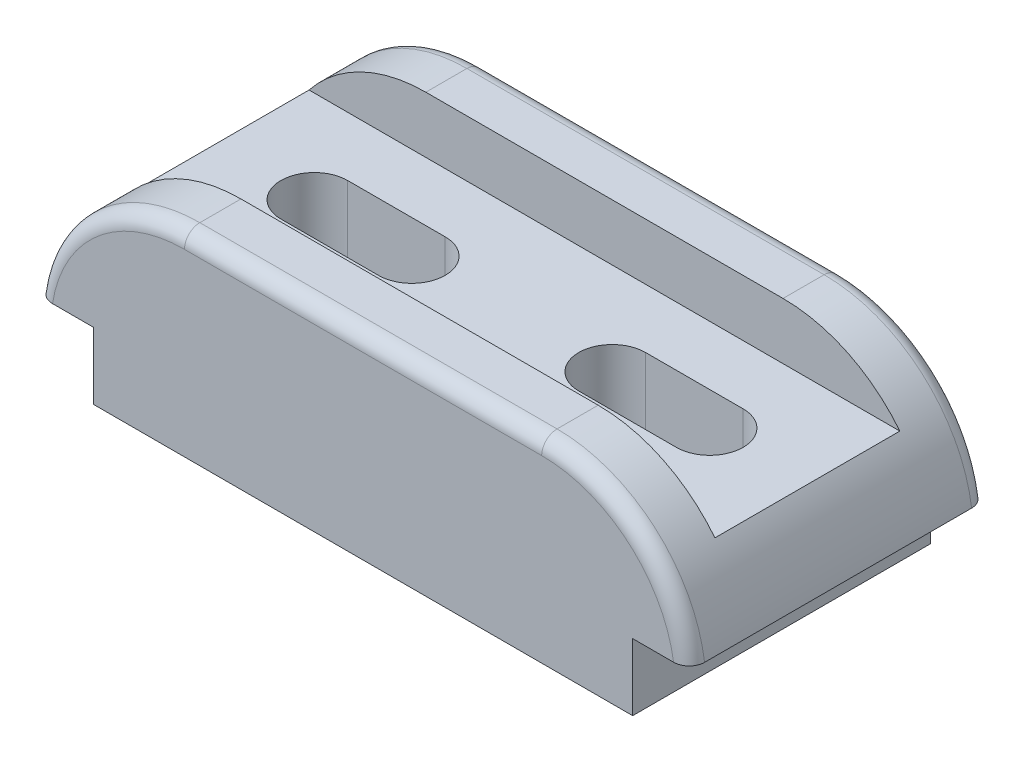
ISO-10303-21;
HEADER;
FILE_DESCRIPTION(('STEP AP214'),'2;1');
FILE_NAME('part.step','',(''),(''),'','','');
FILE_SCHEMA(('AUTOMOTIVE_DESIGN { 1 0 10303 214 1 1 1 1 }'));
ENDSEC;
DATA;
#1=APPLICATION_CONTEXT('core data for automotive mechanical design processes');
#2=APPLICATION_PROTOCOL_DEFINITION('international standard','automotive_design',2000,#1);
#3=PRODUCT_CONTEXT('',#1,'mechanical');
#4=PRODUCT('Part','Part','',(#3));
#5=PRODUCT_RELATED_PRODUCT_CATEGORY('part','',(#4));
#6=PRODUCT_DEFINITION_FORMATION('','',#4);
#7=PRODUCT_DEFINITION_CONTEXT('part definition',#1,'design');
#8=PRODUCT_DEFINITION('design','',#6,#7);
#9=PRODUCT_DEFINITION_SHAPE('','',#8);
#10=(LENGTH_UNIT() NAMED_UNIT(*) SI_UNIT(.MILLI.,.METRE.));
#11=(NAMED_UNIT(*) PLANE_ANGLE_UNIT() SI_UNIT($,.RADIAN.));
#12=(NAMED_UNIT(*) SI_UNIT($,.STERADIAN.) SOLID_ANGLE_UNIT());
#13=UNCERTAINTY_MEASURE_WITH_UNIT(LENGTH_MEASURE(1.E-05),#10,'distance_accuracy_value','');
#14=(GEOMETRIC_REPRESENTATION_CONTEXT(3) GLOBAL_UNCERTAINTY_ASSIGNED_CONTEXT((#13)) GLOBAL_UNIT_ASSIGNED_CONTEXT((#10,
#11,#12)) REPRESENTATION_CONTEXT('',''));
#15=CARTESIAN_POINT('',(0.,0.,0.));
#16=DIRECTION('',(0.,0.,1.));
#17=DIRECTION('',(1.,0.,0.));
#18=AXIS2_PLACEMENT_3D('',#15,#16,#17);
#19=CARTESIAN_POINT('',(-63.5,0.,29.));
#20=DIRECTION('',(0.,1.,0.));
#21=DIRECTION('',(0.,0.,1.));
#22=AXIS2_PLACEMENT_3D('',#19,#20,#21);
#23=PLANE('',#22);
#24=DIRECTION('',(1.,0.,0.));
#25=VECTOR('',#24,1.);
#26=CARTESIAN_POINT('',(-63.5,0.,-29.));
#27=LINE('',#26,#25);
#28=CARTESIAN_POINT('',(-52.5,0.,-29.));
#29=VERTEX_POINT('',#28);
#30=CARTESIAN_POINT('',(52.5,0.,-29.));
#31=VERTEX_POINT('',#30);
#32=EDGE_CURVE('E375',#29,#31,#27,.T.);
#33=ORIENTED_EDGE('',*,*,#32,.T.);
#34=DIRECTION('',(0.,0.,1.));
#35=VECTOR('',#34,1.);
#36=CARTESIAN_POINT('',(52.5,0.,-29.));
#37=LINE('',#36,#35);
#38=CARTESIAN_POINT('',(52.5,0.,29.));
#39=VERTEX_POINT('',#38);
#40=EDGE_CURVE('E338',#31,#39,#37,.T.);
#41=ORIENTED_EDGE('',*,*,#40,.T.);
#42=DIRECTION('',(1.,0.,0.));
#43=VECTOR('',#42,1.);
#44=CARTESIAN_POINT('',(-63.5,0.,29.));
#45=LINE('',#44,#43);
#46=CARTESIAN_POINT('',(-52.5,0.,29.));
#47=VERTEX_POINT('',#46);
#48=EDGE_CURVE('E381',#47,#39,#45,.T.);
#49=ORIENTED_EDGE('',*,*,#48,.F.);
#50=DIRECTION('',(0.,0.,1.));
#51=VECTOR('',#50,1.);
#52=CARTESIAN_POINT('',(-52.5,0.,-29.));
#53=LINE('',#52,#51);
#54=EDGE_CURVE('E364',#29,#47,#53,.T.);
#55=ORIENTED_EDGE('',*,*,#54,.F.);
#56=EDGE_LOOP('',(#33,#41,#49,#55));
#57=FACE_BOUND('',#56,.T.);
#58=DIRECTION('',(1.,0.,0.));
#59=VECTOR('',#58,1.);
#60=CARTESIAN_POINT('',(-19.5,0.,6.5));
#61=LINE('',#60,#59);
#62=CARTESIAN_POINT('',(-38.5,0.,6.5));
#63=VERTEX_POINT('',#62);
#64=CARTESIAN_POINT('',(-19.5,0.,6.5));
#65=VERTEX_POINT('',#64);
#66=EDGE_CURVE('E275',#63,#65,#61,.T.);
#67=ORIENTED_EDGE('',*,*,#66,.T.);
#68=CARTESIAN_POINT('',(-19.5,0.,0.));
#69=DIRECTION('',(0.,1.,0.));
#70=DIRECTION('',(0.,0.,-1.));
#71=AXIS2_PLACEMENT_3D('',#68,#69,#70);
#72=CIRCLE('',#71,6.5);
#73=CARTESIAN_POINT('',(-19.5,0.,-6.5));
#74=VERTEX_POINT('',#73);
#75=EDGE_CURVE('E262',#65,#74,#72,.T.);
#76=ORIENTED_EDGE('',*,*,#75,.T.);
#77=DIRECTION('',(-1.,0.,0.));
#78=VECTOR('',#77,1.);
#79=CARTESIAN_POINT('',(-19.5,0.,-6.5));
#80=LINE('',#79,#78);
#81=CARTESIAN_POINT('',(-38.5,0.,-6.5));
#82=VERTEX_POINT('',#81);
#83=EDGE_CURVE('E266',#74,#82,#80,.T.);
#84=ORIENTED_EDGE('',*,*,#83,.T.);
#85=CARTESIAN_POINT('',(-38.5,0.,0.));
#86=DIRECTION('',(0.,1.,0.));
#87=DIRECTION('',(0.,0.,-1.));
#88=AXIS2_PLACEMENT_3D('',#85,#86,#87);
#89=CIRCLE('',#88,6.5);
#90=EDGE_CURVE('E271',#82,#63,#89,.T.);
#91=ORIENTED_EDGE('',*,*,#90,.T.);
#92=EDGE_LOOP('',(#67,#76,#84,#91));
#93=FACE_BOUND('',#92,.T.);
#94=CARTESIAN_POINT('',(19.5,0.,0.));
#95=DIRECTION('',(0.,-1.,0.));
#96=DIRECTION('',(0.,0.,-1.));
#97=AXIS2_PLACEMENT_3D('',#94,#95,#96);
#98=CIRCLE('',#97,6.5);
#99=CARTESIAN_POINT('',(19.5,0.,6.5));
#100=VERTEX_POINT('',#99);
#101=CARTESIAN_POINT('',(19.5,0.,-6.5));
#102=VERTEX_POINT('',#101);
#103=EDGE_CURVE('E219',#100,#102,#98,.T.);
#104=ORIENTED_EDGE('',*,*,#103,.F.);
#105=DIRECTION('',(-1.,0.,0.));
#106=VECTOR('',#105,1.);
#107=CARTESIAN_POINT('',(19.5,0.,6.5));
#108=LINE('',#107,#106);
#109=CARTESIAN_POINT('',(38.5,0.,6.5));
#110=VERTEX_POINT('',#109);
#111=EDGE_CURVE('E206',#110,#100,#108,.T.);
#112=ORIENTED_EDGE('',*,*,#111,.F.);
#113=CARTESIAN_POINT('',(38.5,0.,0.));
#114=DIRECTION('',(0.,-1.,0.));
#115=DIRECTION('',(0.,0.,-1.));
#116=AXIS2_PLACEMENT_3D('',#113,#114,#115);
#117=CIRCLE('',#116,6.5);
#118=CARTESIAN_POINT('',(38.5,0.,-6.5));
#119=VERTEX_POINT('',#118);
#120=EDGE_CURVE('E218',#119,#110,#117,.T.);
#121=ORIENTED_EDGE('',*,*,#120,.F.);
#122=DIRECTION('',(1.,0.,0.));
#123=VECTOR('',#122,1.);
#124=CARTESIAN_POINT('',(19.5,0.,-6.5));
#125=LINE('',#124,#123);
#126=EDGE_CURVE('E228',#102,#119,#125,.T.);
#127=ORIENTED_EDGE('',*,*,#126,.F.);
#128=EDGE_LOOP('',(#104,#112,#121,#127));
#129=FACE_BOUND('',#128,.T.);
#130=ADVANCED_FACE('F40',(#57,#93,#129),#23,.F.);
#131=CARTESIAN_POINT('',(63.5,27.,-18.));
#132=DIRECTION('',(0.,-1.,0.));
#133=DIRECTION('',(0.,0.,-1.));
#134=AXIS2_PLACEMENT_3D('',#131,#132,#133);
#135=PLANE('',#134);
#136=DIRECTION('',(0.,0.,1.));
#137=VECTOR('',#136,1.);
#138=CARTESIAN_POINT('',(-57.514820769114,27.,29.));
#139=LINE('',#138,#137);
#140=CARTESIAN_POINT('',(-57.514820769114,27.,-18.));
#141=VERTEX_POINT('',#140);
#142=CARTESIAN_POINT('',(-57.514820769114,27.,18.));
#143=VERTEX_POINT('',#142);
#144=EDGE_CURVE('E314',#141,#143,#139,.T.);
#145=ORIENTED_EDGE('',*,*,#144,.T.);
#146=DIRECTION('',(1.,0.,0.));
#147=VECTOR('',#146,1.);
#148=CARTESIAN_POINT('',(63.5,27.,18.));
#149=LINE('',#148,#147);
#150=CARTESIAN_POINT('',(57.514820769114,27.,18.));
#151=VERTEX_POINT('',#150);
#152=EDGE_CURVE('E310',#143,#151,#149,.T.);
#153=ORIENTED_EDGE('',*,*,#152,.T.);
#154=DIRECTION('',(0.,0.,-1.));
#155=VECTOR('',#154,1.);
#156=CARTESIAN_POINT('',(57.514820769114,27.,29.));
#157=LINE('',#156,#155);
#158=CARTESIAN_POINT('',(57.514820769114,27.,-18.));
#159=VERTEX_POINT('',#158);
#160=EDGE_CURVE('E396',#151,#159,#157,.T.);
#161=ORIENTED_EDGE('',*,*,#160,.T.);
#162=DIRECTION('',(-1.,0.,0.));
#163=VECTOR('',#162,1.);
#164=CARTESIAN_POINT('',(63.5,27.,-18.));
#165=LINE('',#164,#163);
#166=EDGE_CURVE('E306',#159,#141,#165,.T.);
#167=ORIENTED_EDGE('',*,*,#166,.T.);
#168=EDGE_LOOP('',(#145,#153,#161,#167));
#169=FACE_BOUND('',#168,.T.);
#170=DIRECTION('',(-1.,0.,0.));
#171=VECTOR('',#170,1.);
#172=CARTESIAN_POINT('',(-19.5,27.,-6.5));
#173=LINE('',#172,#171);
#174=CARTESIAN_POINT('',(-19.5,27.,-6.5));
#175=VERTEX_POINT('',#174);
#176=CARTESIAN_POINT('',(-38.5,27.,-6.5));
#177=VERTEX_POINT('',#176);
#178=EDGE_CURVE('E282',#175,#177,#173,.T.);
#179=ORIENTED_EDGE('',*,*,#178,.F.);
#180=CARTESIAN_POINT('',(-19.5,27.,0.));
#181=DIRECTION('',(0.,1.,0.));
#182=DIRECTION('',(0.,0.,-1.));
#183=AXIS2_PLACEMENT_3D('',#180,#181,#182);
#184=CIRCLE('',#183,6.5);
#185=CARTESIAN_POINT('',(-19.5,27.,6.5));
#186=VERTEX_POINT('',#185);
#187=EDGE_CURVE('E256',#186,#175,#184,.T.);
#188=ORIENTED_EDGE('',*,*,#187,.F.);
#189=DIRECTION('',(1.,0.,0.));
#190=VECTOR('',#189,1.);
#191=CARTESIAN_POINT('',(-19.5,27.,6.5));
#192=LINE('',#191,#190);
#193=CARTESIAN_POINT('',(-38.5,27.,6.5));
#194=VERTEX_POINT('',#193);
#195=EDGE_CURVE('E267',#194,#186,#192,.T.);
#196=ORIENTED_EDGE('',*,*,#195,.F.);
#197=CARTESIAN_POINT('',(-38.5,27.,0.));
#198=DIRECTION('',(0.,1.,0.));
#199=DIRECTION('',(0.,0.,-1.));
#200=AXIS2_PLACEMENT_3D('',#197,#198,#199);
#201=CIRCLE('',#200,6.5);
#202=EDGE_CURVE('E286',#177,#194,#201,.T.);
#203=ORIENTED_EDGE('',*,*,#202,.F.);
#204=EDGE_LOOP('',(#179,#188,#196,#203));
#205=FACE_BOUND('',#204,.T.);
#206=CARTESIAN_POINT('',(19.5,27.,0.));
#207=DIRECTION('',(0.,-1.,0.));
#208=DIRECTION('',(0.,0.,-1.));
#209=AXIS2_PLACEMENT_3D('',#206,#207,#208);
#210=CIRCLE('',#209,6.5);
#211=CARTESIAN_POINT('',(19.5,27.,6.5));
#212=VERTEX_POINT('',#211);
#213=CARTESIAN_POINT('',(19.5,27.,-6.5));
#214=VERTEX_POINT('',#213);
#215=EDGE_CURVE('E226',#212,#214,#210,.T.);
#216=ORIENTED_EDGE('',*,*,#215,.T.);
#217=DIRECTION('',(1.,0.,0.));
#218=VECTOR('',#217,1.);
#219=CARTESIAN_POINT('',(19.5,27.,-6.5));
#220=LINE('',#219,#218);
#221=CARTESIAN_POINT('',(38.5,27.,-6.5));
#222=VERTEX_POINT('',#221);
#223=EDGE_CURVE('E232',#214,#222,#220,.T.);
#224=ORIENTED_EDGE('',*,*,#223,.T.);
#225=CARTESIAN_POINT('',(38.5,27.,0.));
#226=DIRECTION('',(0.,-1.,0.));
#227=DIRECTION('',(0.,0.,-1.));
#228=AXIS2_PLACEMENT_3D('',#225,#226,#227);
#229=CIRCLE('',#228,6.5);
#230=CARTESIAN_POINT('',(38.5,27.,6.5));
#231=VERTEX_POINT('',#230);
#232=EDGE_CURVE('E237',#222,#231,#229,.T.);
#233=ORIENTED_EDGE('',*,*,#232,.T.);
#234=DIRECTION('',(-1.,0.,0.));
#235=VECTOR('',#234,1.);
#236=CARTESIAN_POINT('',(19.5,27.,6.5));
#237=LINE('',#236,#235);
#238=EDGE_CURVE('E246',#231,#212,#237,.T.);
#239=ORIENTED_EDGE('',*,*,#238,.T.);
#240=EDGE_LOOP('',(#216,#224,#233,#239));
#241=FACE_BOUND('',#240,.T.);
#242=ADVANCED_FACE('F497',(#169,#205,#241),#135,.F.);
#243=CARTESIAN_POINT('',(-63.5,38.,29.));
#244=DIRECTION('',(0.,-1.,0.));
#245=DIRECTION('',(0.,0.,-1.));
#246=AXIS2_PLACEMENT_3D('',#243,#244,#245);
#247=PLANE('',#246);
#248=DIRECTION('',(0.,0.,1.));
#249=VECTOR('',#248,1.);
#250=CARTESIAN_POINT('',(-34.7771867673099,38.,29.));
#251=LINE('',#250,#249);
#252=CARTESIAN_POINT('',(-34.7771867673099,38.,18.));
#253=VERTEX_POINT('',#252);
#254=CARTESIAN_POINT('',(-34.7771867673099,38.,26.));
#255=VERTEX_POINT('',#254);
#256=EDGE_CURVE('E392',#253,#255,#251,.T.);
#257=ORIENTED_EDGE('',*,*,#256,.T.);
#258=DIRECTION('',(-1.,0.,0.));
#259=VECTOR('',#258,1.);
#260=CARTESIAN_POINT('',(-63.5,38.,26.));
#261=LINE('',#260,#259);
#262=CARTESIAN_POINT('',(34.7771867673099,38.,26.));
#263=VERTEX_POINT('',#262);
#264=EDGE_CURVE('E11',#255,#263,#261,.F.);
#265=ORIENTED_EDGE('',*,*,#264,.T.);
#266=DIRECTION('',(0.,0.,-1.));
#267=VECTOR('',#266,1.);
#268=CARTESIAN_POINT('',(34.7771867673099,38.,29.));
#269=LINE('',#268,#267);
#270=CARTESIAN_POINT('',(34.7771867673099,38.,18.));
#271=VERTEX_POINT('',#270);
#272=EDGE_CURVE('E389',#263,#271,#269,.T.);
#273=ORIENTED_EDGE('',*,*,#272,.T.);
#274=DIRECTION('',(1.,0.,0.));
#275=VECTOR('',#274,1.);
#276=CARTESIAN_POINT('',(63.5,38.,18.));
#277=LINE('',#276,#275);
#278=EDGE_CURVE('E311',#253,#271,#277,.T.);
#279=ORIENTED_EDGE('',*,*,#278,.F.);
#280=EDGE_LOOP('',(#257,#265,#273,#279));
#281=FACE_BOUND('',#280,.T.);
#282=ADVANCED_FACE('F503',(#281),#247,.F.);
#283=CARTESIAN_POINT('',(34.7771867673099,38.,-18.));
#284=VERTEX_POINT('',#283);
#285=CARTESIAN_POINT('',(34.7771867673099,38.,-26.));
#286=VERTEX_POINT('',#285);
#287=EDGE_CURVE('E385',#284,#286,#269,.T.);
#288=ORIENTED_EDGE('',*,*,#287,.T.);
#289=DIRECTION('',(-1.,0.,0.));
#290=VECTOR('',#289,1.);
#291=CARTESIAN_POINT('',(-34.7771867673099,38.,-26.));
#292=LINE('',#291,#290);
#293=CARTESIAN_POINT('',(-34.7771867673099,38.,-26.));
#294=VERTEX_POINT('',#293);
#295=EDGE_CURVE('E51',#286,#294,#292,.T.);
#296=ORIENTED_EDGE('',*,*,#295,.T.);
#297=CARTESIAN_POINT('',(-34.7771867673099,38.,-18.));
#298=VERTEX_POINT('',#297);
#299=EDGE_CURVE('E393',#294,#298,#251,.T.);
#300=ORIENTED_EDGE('',*,*,#299,.T.);
#301=DIRECTION('',(-1.,0.,0.));
#302=VECTOR('',#301,1.);
#303=CARTESIAN_POINT('',(63.5,38.,-18.));
#304=LINE('',#303,#302);
#305=EDGE_CURVE('E296',#284,#298,#304,.T.);
#306=ORIENTED_EDGE('',*,*,#305,.F.);
#307=EDGE_LOOP('',(#288,#296,#300,#306));
#308=FACE_BOUND('',#307,.T.);
#309=ADVANCED_FACE('F499',(#308),#247,.F.);
#310=CARTESIAN_POINT('',(-63.5,38.,29.));
#311=DIRECTION('',(0.,0.,-1.));
#312=DIRECTION('',(-1.,0.,0.));
#313=AXIS2_PLACEMENT_3D('',#310,#311,#312);
#314=PLANE('',#313);
#315=DIRECTION('',(-1.,0.,0.));
#316=VECTOR('',#315,1.);
#317=CARTESIAN_POINT('',(52.5,13.,29.));
#318=LINE('',#317,#316);
#319=CARTESIAN_POINT('',(60.4676519246401,13.,29.));
#320=VERTEX_POINT('',#319);
#321=CARTESIAN_POINT('',(52.5,13.,29.));
#322=VERTEX_POINT('',#321);
#323=EDGE_CURVE('E335',#320,#322,#318,.T.);
#324=ORIENTED_EDGE('',*,*,#323,.F.);
#325=CARTESIAN_POINT('',(34.7771867673099,9.,29.));
#326=DIRECTION('',(0.,0.,-1.));
#327=DIRECTION('',(-1.,0.,0.));
#328=AXIS2_PLACEMENT_3D('',#325,#326,#327);
#329=CIRCLE('',#328,26.);
#330=CARTESIAN_POINT('',(34.7771867673099,35.,29.));
#331=VERTEX_POINT('',#330);
#332=EDGE_CURVE('E512',#320,#331,#329,.F.);
#333=ORIENTED_EDGE('',*,*,#332,.T.);
#334=DIRECTION('',(-1.,0.,0.));
#335=VECTOR('',#334,1.);
#336=CARTESIAN_POINT('',(-63.5,35.,29.));
#337=LINE('',#336,#335);
#338=CARTESIAN_POINT('',(-34.7771867673099,35.,29.));
#339=VERTEX_POINT('',#338);
#340=EDGE_CURVE('E59',#331,#339,#337,.T.);
#341=ORIENTED_EDGE('',*,*,#340,.T.);
#342=CARTESIAN_POINT('',(-34.7771867673099,9.,29.));
#343=DIRECTION('',(0.,0.,-1.));
#344=DIRECTION('',(-1.,0.,0.));
#345=AXIS2_PLACEMENT_3D('',#342,#343,#344);
#346=CIRCLE('',#345,26.);
#347=CARTESIAN_POINT('',(-60.4676519246401,13.,29.));
#348=VERTEX_POINT('',#347);
#349=EDGE_CURVE('E516',#339,#348,#346,.F.);
#350=ORIENTED_EDGE('',*,*,#349,.T.);
#351=DIRECTION('',(-1.,0.,0.));
#352=VECTOR('',#351,1.);
#353=CARTESIAN_POINT('',(-63.5,13.,29.));
#354=LINE('',#353,#352);
#355=CARTESIAN_POINT('',(-52.5,13.,29.));
#356=VERTEX_POINT('',#355);
#357=EDGE_CURVE('E360',#356,#348,#354,.T.);
#358=ORIENTED_EDGE('',*,*,#357,.F.);
#359=DIRECTION('',(0.,1.,0.));
#360=VECTOR('',#359,1.);
#361=CARTESIAN_POINT('',(-52.5,13.,29.));
#362=LINE('',#361,#360);
#363=EDGE_CURVE('E347',#47,#356,#362,.T.);
#364=ORIENTED_EDGE('',*,*,#363,.F.);
#365=ORIENTED_EDGE('',*,*,#48,.T.);
#366=DIRECTION('',(0.,-1.,0.));
#367=VECTOR('',#366,1.);
#368=CARTESIAN_POINT('',(52.5,0.,29.));
#369=LINE('',#368,#367);
#370=EDGE_CURVE('E329',#322,#39,#369,.T.);
#371=ORIENTED_EDGE('',*,*,#370,.F.);
#372=EDGE_LOOP('',(#324,#333,#341,#350,#358,#364,#365,#371));
#373=FACE_BOUND('',#372,.T.);
#374=ADVANCED_FACE('F502',(#373),#314,.F.);
#375=CARTESIAN_POINT('',(-63.5,38.,-29.));
#376=DIRECTION('',(0.,0.,-1.));
#377=DIRECTION('',(-1.,0.,0.));
#378=AXIS2_PLACEMENT_3D('',#375,#376,#377);
#379=PLANE('',#378);
#380=DIRECTION('',(-1.,0.,0.));
#381=VECTOR('',#380,1.);
#382=CARTESIAN_POINT('',(34.7771867673099,35.,-29.));
#383=LINE('',#382,#381);
#384=CARTESIAN_POINT('',(-34.7771867673099,35.,-29.));
#385=VERTEX_POINT('',#384);
#386=CARTESIAN_POINT('',(34.7771867673099,35.,-29.));
#387=VERTEX_POINT('',#386);
#388=EDGE_CURVE('E406',#385,#387,#383,.F.);
#389=ORIENTED_EDGE('',*,*,#388,.T.);
#390=CARTESIAN_POINT('',(34.7771867673099,9.,-29.));
#391=DIRECTION('',(0.,0.,-1.));
#392=DIRECTION('',(-1.,0.,0.));
#393=AXIS2_PLACEMENT_3D('',#390,#391,#392);
#394=CIRCLE('',#393,26.);
#395=CARTESIAN_POINT('',(60.4676519246401,13.,-29.));
#396=VERTEX_POINT('',#395);
#397=EDGE_CURVE('E412',#387,#396,#394,.T.);
#398=ORIENTED_EDGE('',*,*,#397,.T.);
#399=DIRECTION('',(-1.,0.,0.));
#400=VECTOR('',#399,1.);
#401=CARTESIAN_POINT('',(52.5,13.,-29.));
#402=LINE('',#401,#400);
#403=CARTESIAN_POINT('',(52.5,13.,-29.));
#404=VERTEX_POINT('',#403);
#405=EDGE_CURVE('E334',#396,#404,#402,.T.);
#406=ORIENTED_EDGE('',*,*,#405,.T.);
#407=DIRECTION('',(0.,-1.,0.));
#408=VECTOR('',#407,1.);
#409=CARTESIAN_POINT('',(52.5,0.,-29.));
#410=LINE('',#409,#408);
#411=EDGE_CURVE('E330',#404,#31,#410,.T.);
#412=ORIENTED_EDGE('',*,*,#411,.T.);
#413=ORIENTED_EDGE('',*,*,#32,.F.);
#414=DIRECTION('',(0.,1.,0.));
#415=VECTOR('',#414,1.);
#416=CARTESIAN_POINT('',(-52.5,13.,-29.));
#417=LINE('',#416,#415);
#418=CARTESIAN_POINT('',(-52.5,13.,-29.));
#419=VERTEX_POINT('',#418);
#420=EDGE_CURVE('E355',#29,#419,#417,.T.);
#421=ORIENTED_EDGE('',*,*,#420,.T.);
#422=DIRECTION('',(-1.,0.,0.));
#423=VECTOR('',#422,1.);
#424=CARTESIAN_POINT('',(-63.5,13.,-29.));
#425=LINE('',#424,#423);
#426=CARTESIAN_POINT('',(-60.4676519246401,13.,-29.));
#427=VERTEX_POINT('',#426);
#428=EDGE_CURVE('E359',#419,#427,#425,.T.);
#429=ORIENTED_EDGE('',*,*,#428,.T.);
#430=CARTESIAN_POINT('',(-34.7771867673099,9.,-29.));
#431=DIRECTION('',(0.,0.,-1.));
#432=DIRECTION('',(-1.,0.,0.));
#433=AXIS2_PLACEMENT_3D('',#430,#431,#432);
#434=CIRCLE('',#433,26.);
#435=EDGE_CURVE('E409',#427,#385,#434,.T.);
#436=ORIENTED_EDGE('',*,*,#435,.T.);
#437=EDGE_LOOP('',(#389,#398,#406,#412,#413,#421,#429,#436));
#438=FACE_BOUND('',#437,.T.);
#439=ADVANCED_FACE('F454',(#438),#379,.T.);
#440=CARTESIAN_POINT('',(-63.5,13.,-29.));
#441=DIRECTION('',(0.,1.,0.));
#442=DIRECTION('',(-1.,0.,0.));
#443=AXIS2_PLACEMENT_3D('',#440,#441,#442);
#444=PLANE('',#443);
#445=DIRECTION('',(0.,0.,1.));
#446=VECTOR('',#445,1.);
#447=CARTESIAN_POINT('',(-63.5,13.,-29.));
#448=LINE('',#447,#446);
#449=CARTESIAN_POINT('',(-63.5,13.,-26.));
#450=VERTEX_POINT('',#449);
#451=CARTESIAN_POINT('',(-63.5,13.,26.));
#452=VERTEX_POINT('',#451);
#453=EDGE_CURVE('E371',#450,#452,#448,.T.);
#454=ORIENTED_EDGE('',*,*,#453,.F.);
#455=CARTESIAN_POINT('',(-63.5,13.,-26.));
#456=CARTESIAN_POINT('',(-63.500008537323,13.,-26.0837757292173));
#457=CARTESIAN_POINT('',(-63.4964570017645,13.,-26.167547405341));
#458=CARTESIAN_POINT('',(-63.4822997537084,13.,-26.3344872584748));
#459=CARTESIAN_POINT('',(-63.4716945017307,13.,-26.4176554745249));
#460=CARTESIAN_POINT('',(-63.4435099683394,13.,-26.5827209739181));
#461=CARTESIAN_POINT('',(-63.4259377188605,13.,-26.6646194524908));
#462=CARTESIAN_POINT('',(-63.3839682526341,13.,-26.8266241803314));
#463=CARTESIAN_POINT('',(-63.3595710969821,13.,-26.906730445636));
#464=CARTESIAN_POINT('',(-63.2763566695641,13.,-27.143576085334));
#465=CARTESIAN_POINT('',(-63.2075023828091,13.,-27.2969240834404));
#466=CARTESIAN_POINT('',(-63.0451660734999,13.,-27.5898398733993));
#467=CARTESIAN_POINT('',(-62.9516866662251,13.,-27.7294091264433));
#468=CARTESIAN_POINT('',(-62.7423827970622,13.,-27.9915689367043));
#469=CARTESIAN_POINT('',(-62.62647228502,13.,-28.1140908814078));
#470=CARTESIAN_POINT('',(-62.3758723927165,13.,-28.3381648672226));
#471=CARTESIAN_POINT('',(-62.2411791936909,13.,-28.4397126335675));
#472=CARTESIAN_POINT('',(-61.9555359251202,13.,-28.619957430038));
#473=CARTESIAN_POINT('',(-61.8044459638174,13.,-28.6984325311074));
#474=CARTESIAN_POINT('',(-61.491348493947,13.,-28.8291619742861));
#475=CARTESIAN_POINT('',(-61.3293455257604,13.,-28.8814271455965));
#476=CARTESIAN_POINT('',(-61.0500647079101,13.,-28.9465449737839));
#477=CARTESIAN_POINT('',(-60.9344078897067,13.,-28.9665822679173));
#478=CARTESIAN_POINT('',(-60.7017320444993,13.,-28.9933087805189));
#479=CARTESIAN_POINT('',(-60.5847152345171,13.,-29.0000173010041));
#480=CARTESIAN_POINT('',(-60.4676519246401,13.,-29.));
#481=B_SPLINE_CURVE_WITH_KNOTS('',3,(#455,#456,#457,#458,#459,#460,#461,#462,#463,#464,#465,
#466,#467,#468,#469,#470,#471,#472,#473,#474,#475,#476,#477,#478,#479,#480),.UNSPECIFIED.,.F.,
.F.,(4,2,2,2,2,2,2,2,2,2,2,2,4),(0.,0.251244686579993,0.502472971620109,0.75344832965382,
1.00442144106396,1.50612186357655,2.00776902510076,2.51138018273311,3.0150938807496,
3.52350503045669,4.03170594564024,4.38312187733562,4.73402853527273),.UNSPECIFIED.);
#482=EDGE_CURVE('E466',#450,#427,#481,.T.);
#483=ORIENTED_EDGE('',*,*,#482,.T.);
#484=ORIENTED_EDGE('',*,*,#428,.F.);
#485=DIRECTION('',(0.,0.,1.));
#486=VECTOR('',#485,1.);
#487=CARTESIAN_POINT('',(-52.5,13.,-29.));
#488=LINE('',#487,#486);
#489=EDGE_CURVE('E376',#419,#356,#488,.T.);
#490=ORIENTED_EDGE('',*,*,#489,.T.);
#491=ORIENTED_EDGE('',*,*,#357,.T.);
#492=CARTESIAN_POINT('',(-60.4676519246401,13.,29.));
#493=CARTESIAN_POINT('',(-60.5536595763136,13.,29.0000075901684));
#494=CARTESIAN_POINT('',(-60.6396641095484,13.,28.9963888758898));
#495=CARTESIAN_POINT('',(-60.8110656792601,13.,28.9819522831555));
#496=CARTESIAN_POINT('',(-60.8964627239799,13.,28.9711345025716));
#497=CARTESIAN_POINT('',(-61.0660180208638,13.,28.9423587191555));
#498=CARTESIAN_POINT('',(-61.1501767340039,13.,28.9244034468));
#499=CARTESIAN_POINT('',(-61.3166620520823,13.,28.8814856022155));
#500=CARTESIAN_POINT('',(-61.3989886936515,13.,28.8565231702257));
#501=CARTESIAN_POINT('',(-61.6424498334356,13.,28.7712949191688));
#502=CARTESIAN_POINT('',(-61.8001050015855,13.,28.7006814272453));
#503=CARTESIAN_POINT('',(-62.1010875158092,13.,28.5338762823474));
#504=CARTESIAN_POINT('',(-62.244419071325,13.,28.4376921746946));
#505=CARTESIAN_POINT('',(-62.5118417982588,13.,28.2230421440956));
#506=CARTESIAN_POINT('',(-62.6360485154398,13.,28.1047204413167));
#507=CARTESIAN_POINT('',(-62.8626036365883,13.,27.8486813498157));
#508=CARTESIAN_POINT('',(-62.9649481065778,13.,27.7109604777174));
#509=CARTESIAN_POINT('',(-63.1437497305194,13.,27.4215685764939));
#510=CARTESIAN_POINT('',(-63.2204574283972,13.,27.2700521573139));
#511=CARTESIAN_POINT('',(-63.3470526372316,13.,26.9562542449057));
#512=CARTESIAN_POINT('',(-63.3969596813004,13.,26.7939806889721));
#513=CARTESIAN_POINT('',(-63.4550865999914,13.,26.5254642180049));
#514=CARTESIAN_POINT('',(-63.4719195794528,13.,26.421007946461));
#515=CARTESIAN_POINT('',(-63.4943737390324,13.,26.2110500695112));
#516=CARTESIAN_POINT('',(-63.5000110628034,13.,26.1055501900352));
#517=CARTESIAN_POINT('',(-63.5,13.,26.));
#518=B_SPLINE_CURVE_WITH_KNOTS('',3,(#492,#493,#494,#495,#496,#497,#498,#499,#500,#501,#502,
#503,#504,#505,#506,#507,#508,#509,#510,#511,#512,#513,#514,#515,#516,#517),.UNSPECIFIED.,.F.,
.F.,(4,2,2,2,2,2,2,2,2,2,2,2,4),(0.,0.257940986380796,0.515878466105757,0.773717365614568,
1.0315511051859,1.54710003076188,2.06249699781018,2.57464636761747,3.08688781809344,
3.59396590413454,4.10067391329319,4.41753309211493,4.73393504096472),.UNSPECIFIED.);
#519=EDGE_CURVE('E459',#348,#452,#518,.T.);
#520=ORIENTED_EDGE('',*,*,#519,.T.);
#521=EDGE_LOOP('',(#454,#483,#484,#490,#491,#520));
#522=FACE_BOUND('',#521,.T.);
#523=ADVANCED_FACE('F450',(#522),#444,.F.);
#524=CARTESIAN_POINT('',(-52.5,13.,-29.));
#525=DIRECTION('',(1.,0.,0.));
#526=DIRECTION('',(0.,1.,0.));
#527=AXIS2_PLACEMENT_3D('',#524,#525,#526);
#528=PLANE('',#527);
#529=ORIENTED_EDGE('',*,*,#363,.T.);
#530=ORIENTED_EDGE('',*,*,#489,.F.);
#531=ORIENTED_EDGE('',*,*,#420,.F.);
#532=ORIENTED_EDGE('',*,*,#54,.T.);
#533=EDGE_LOOP('',(#529,#530,#531,#532));
#534=FACE_BOUND('',#533,.T.);
#535=ADVANCED_FACE('F448',(#534),#528,.F.);
#536=CARTESIAN_POINT('',(52.5,0.,-29.));
#537=DIRECTION('',(-1.,0.,0.));
#538=DIRECTION('',(0.,0.,1.));
#539=AXIS2_PLACEMENT_3D('',#536,#537,#538);
#540=PLANE('',#539);
#541=ORIENTED_EDGE('',*,*,#370,.T.);
#542=ORIENTED_EDGE('',*,*,#40,.F.);
#543=ORIENTED_EDGE('',*,*,#411,.F.);
#544=DIRECTION('',(0.,0.,1.));
#545=VECTOR('',#544,1.);
#546=CARTESIAN_POINT('',(52.5,13.,-29.));
#547=LINE('',#546,#545);
#548=EDGE_CURVE('E343',#404,#322,#547,.T.);
#549=ORIENTED_EDGE('',*,*,#548,.T.);
#550=EDGE_LOOP('',(#541,#542,#543,#549));
#551=FACE_BOUND('',#550,.T.);
#552=ADVANCED_FACE('F441',(#551),#540,.F.);
#553=CARTESIAN_POINT('',(52.5,13.,-29.));
#554=DIRECTION('',(0.,1.,0.));
#555=DIRECTION('',(-1.,0.,0.));
#556=AXIS2_PLACEMENT_3D('',#553,#554,#555);
#557=PLANE('',#556);
#558=ORIENTED_EDGE('',*,*,#405,.F.);
#559=CARTESIAN_POINT('',(60.4676519246401,13.,-29.));
#560=CARTESIAN_POINT('',(60.5536595763136,13.,-29.0000075901684));
#561=CARTESIAN_POINT('',(60.6396641095484,13.,-28.9963888758898));
#562=CARTESIAN_POINT('',(60.8110656792601,13.,-28.9819522831555));
#563=CARTESIAN_POINT('',(60.8964627239799,13.,-28.9711345025716));
#564=CARTESIAN_POINT('',(61.0660180208638,13.,-28.9423587191556));
#565=CARTESIAN_POINT('',(61.1501767340039,13.,-28.9244034468));
#566=CARTESIAN_POINT('',(61.3166620520823,13.,-28.8814856022155));
#567=CARTESIAN_POINT('',(61.3989886936515,13.,-28.8565231702257));
#568=CARTESIAN_POINT('',(61.6424498334356,13.,-28.7712949191688));
#569=CARTESIAN_POINT('',(61.8001050015856,13.,-28.7006814272453));
#570=CARTESIAN_POINT('',(62.1010875158092,13.,-28.5338762823474));
#571=CARTESIAN_POINT('',(62.244419071325,13.,-28.4376921746946));
#572=CARTESIAN_POINT('',(62.5118417982588,13.,-28.2230421440956));
#573=CARTESIAN_POINT('',(62.6360485154398,13.,-28.1047204413167));
#574=CARTESIAN_POINT('',(62.8626036365883,13.,-27.8486813498157));
#575=CARTESIAN_POINT('',(62.9649481065778,13.,-27.7109604777174));
#576=CARTESIAN_POINT('',(63.1437497305194,13.,-27.4215685764939));
#577=CARTESIAN_POINT('',(63.2204574283972,13.,-27.2700521573139));
#578=CARTESIAN_POINT('',(63.3470526372316,13.,-26.9562542449057));
#579=CARTESIAN_POINT('',(63.3969596813004,13.,-26.7939806889721));
#580=CARTESIAN_POINT('',(63.4550865999914,13.,-26.5254642180049));
#581=CARTESIAN_POINT('',(63.4719195794528,13.,-26.421007946461));
#582=CARTESIAN_POINT('',(63.4943737390324,13.,-26.2110500695112));
#583=CARTESIAN_POINT('',(63.5000110628034,13.,-26.1055501900352));
#584=CARTESIAN_POINT('',(63.5,13.,-26.));
#585=B_SPLINE_CURVE_WITH_KNOTS('',3,(#559,#560,#561,#562,#563,#564,#565,#566,#567,#568,#569,
#570,#571,#572,#573,#574,#575,#576,#577,#578,#579,#580,#581,#582,#583,#584),.UNSPECIFIED.,.F.,
.F.,(4,2,2,2,2,2,2,2,2,2,2,2,4),(0.,0.257940986380796,0.515878466105757,0.773717365614568,
1.0315511051859,1.54710003076189,2.0624969978102,2.57464636761747,3.08688781809344,
3.59396590413454,4.10067391329319,4.41753309211493,4.73393504096472),.UNSPECIFIED.);
#586=CARTESIAN_POINT('',(63.5,13.,-26.));
#587=VERTEX_POINT('',#586);
#588=EDGE_CURVE('E425',#396,#587,#585,.T.);
#589=ORIENTED_EDGE('',*,*,#588,.T.);
#590=DIRECTION('',(0.,0.,1.));
#591=VECTOR('',#590,1.);
#592=CARTESIAN_POINT('',(63.5,13.,-29.));
#593=LINE('',#592,#591);
#594=CARTESIAN_POINT('',(63.5,13.,26.));
#595=VERTEX_POINT('',#594);
#596=EDGE_CURVE('E348',#587,#595,#593,.T.);
#597=ORIENTED_EDGE('',*,*,#596,.T.);
#598=CARTESIAN_POINT('',(63.5,13.,26.));
#599=CARTESIAN_POINT('',(63.500008537323,13.,26.0837757292173));
#600=CARTESIAN_POINT('',(63.4964570017645,13.,26.167547405341));
#601=CARTESIAN_POINT('',(63.4822997537084,13.,26.3344872584748));
#602=CARTESIAN_POINT('',(63.4716945017307,13.,26.4176554745249));
#603=CARTESIAN_POINT('',(63.4435099683394,13.,26.5827209739181));
#604=CARTESIAN_POINT('',(63.4259377188605,13.,26.6646194524908));
#605=CARTESIAN_POINT('',(63.3839682526341,13.,26.8266241803314));
#606=CARTESIAN_POINT('',(63.3595710969821,13.,26.906730445636));
#607=CARTESIAN_POINT('',(63.2763566695641,13.,27.143576085334));
#608=CARTESIAN_POINT('',(63.2075023828091,13.,27.2969240834404));
#609=CARTESIAN_POINT('',(63.0451660734999,13.,27.5898398733993));
#610=CARTESIAN_POINT('',(62.9516866662251,13.,27.7294091264433));
#611=CARTESIAN_POINT('',(62.7423827970622,13.,27.9915689367043));
#612=CARTESIAN_POINT('',(62.62647228502,13.,28.1140908814078));
#613=CARTESIAN_POINT('',(62.3758723927165,13.,28.3381648672226));
#614=CARTESIAN_POINT('',(62.2411791936909,13.,28.4397126335675));
#615=CARTESIAN_POINT('',(61.9555359251202,13.,28.619957430038));
#616=CARTESIAN_POINT('',(61.8044459638174,13.,28.6984325311074));
#617=CARTESIAN_POINT('',(61.491348493947,13.,28.8291619742861));
#618=CARTESIAN_POINT('',(61.3293455257604,13.,28.8814271455965));
#619=CARTESIAN_POINT('',(61.0500647079101,13.,28.9465449737839));
#620=CARTESIAN_POINT('',(60.9344078897067,13.,28.9665822679173));
#621=CARTESIAN_POINT('',(60.7017320444993,13.,28.9933087805189));
#622=CARTESIAN_POINT('',(60.5847152345171,13.,29.0000173010041));
#623=CARTESIAN_POINT('',(60.4676519246401,13.,29.));
#624=B_SPLINE_CURVE_WITH_KNOTS('',3,(#598,#599,#600,#601,#602,#603,#604,#605,#606,#607,#608,
#609,#610,#611,#612,#613,#614,#615,#616,#617,#618,#619,#620,#621,#622,#623),.UNSPECIFIED.,.F.,
.F.,(4,2,2,2,2,2,2,2,2,2,2,2,4),(0.,0.251244686579993,0.502472971620109,0.753448329653817,
1.00442144106396,1.50612186357655,2.00776902510076,2.51138018273311,3.0150938807496,
3.52350503045669,4.03170594564023,4.38312187733562,4.73402853527273),.UNSPECIFIED.);
#625=EDGE_CURVE('E416',#595,#320,#624,.T.);
#626=ORIENTED_EDGE('',*,*,#625,.T.);
#627=ORIENTED_EDGE('',*,*,#323,.T.);
#628=ORIENTED_EDGE('',*,*,#548,.F.);
#629=EDGE_LOOP('',(#558,#589,#597,#626,#627,#628));
#630=FACE_BOUND('',#629,.T.);
#631=ADVANCED_FACE('F435',(#630),#557,.F.);
#632=CARTESIAN_POINT('',(-34.7771867673099,9.,29.));
#633=DIRECTION('',(0.,0.,1.));
#634=DIRECTION('',(1.,0.,0.));
#635=AXIS2_PLACEMENT_3D('',#632,#633,#634);
#636=CYLINDRICAL_SURFACE('',#635,29.);
#637=ORIENTED_EDGE('',*,*,#299,.F.);
#638=CARTESIAN_POINT('',(-34.7771867673099,9.,-26.));
#639=DIRECTION('',(0.,0.,-1.));
#640=DIRECTION('',(-1.,0.,0.));
#641=AXIS2_PLACEMENT_3D('',#638,#639,#640);
#642=CIRCLE('',#641,29.);
#643=EDGE_CURVE('E568',#294,#450,#642,.F.);
#644=ORIENTED_EDGE('',*,*,#643,.T.);
#645=ORIENTED_EDGE('',*,*,#453,.T.);
#646=CARTESIAN_POINT('',(-34.7771867673099,9.,26.));
#647=DIRECTION('',(0.,0.,-1.));
#648=DIRECTION('',(-1.,0.,0.));
#649=AXIS2_PLACEMENT_3D('',#646,#647,#648);
#650=CIRCLE('',#649,29.);
#651=EDGE_CURVE('E541',#452,#255,#650,.T.);
#652=ORIENTED_EDGE('',*,*,#651,.T.);
#653=ORIENTED_EDGE('',*,*,#256,.F.);
#654=CARTESIAN_POINT('',(-34.7771867673099,9.,18.));
#655=DIRECTION('',(0.,0.,1.));
#656=DIRECTION('',(1.,0.,0.));
#657=AXIS2_PLACEMENT_3D('',#654,#655,#656);
#658=CIRCLE('',#657,29.);
#659=EDGE_CURVE('E326',#143,#253,#658,.F.);
#660=ORIENTED_EDGE('',*,*,#659,.F.);
#661=ORIENTED_EDGE('',*,*,#144,.F.);
#662=CARTESIAN_POINT('',(-34.7771867673099,9.,-18.));
#663=DIRECTION('',(0.,0.,-1.));
#664=DIRECTION('',(-1.,0.,0.));
#665=AXIS2_PLACEMENT_3D('',#662,#663,#664);
#666=CIRCLE('',#665,29.);
#667=EDGE_CURVE('E323',#298,#141,#666,.F.);
#668=ORIENTED_EDGE('',*,*,#667,.F.);
#669=EDGE_LOOP('',(#637,#644,#645,#652,#653,#660,#661,#668));
#670=FACE_BOUND('',#669,.T.);
#671=ADVANCED_FACE('F440',(#670),#636,.T.);
#672=CARTESIAN_POINT('',(34.7771867673099,9.,29.));
#673=DIRECTION('',(0.,0.,-1.));
#674=DIRECTION('',(-1.,0.,0.));
#675=AXIS2_PLACEMENT_3D('',#672,#673,#674);
#676=CYLINDRICAL_SURFACE('',#675,29.);
#677=ORIENTED_EDGE('',*,*,#596,.F.);
#678=CARTESIAN_POINT('',(34.7771867673099,9.,-26.));
#679=DIRECTION('',(0.,0.,-1.));
#680=DIRECTION('',(-1.,0.,0.));
#681=AXIS2_PLACEMENT_3D('',#678,#679,#680);
#682=CIRCLE('',#681,29.);
#683=EDGE_CURVE('E559',#587,#286,#682,.F.);
#684=ORIENTED_EDGE('',*,*,#683,.T.);
#685=ORIENTED_EDGE('',*,*,#287,.F.);
#686=CARTESIAN_POINT('',(34.7771867673099,9.,-18.));
#687=DIRECTION('',(0.,0.,-1.));
#688=DIRECTION('',(-1.,0.,0.));
#689=AXIS2_PLACEMENT_3D('',#686,#687,#688);
#690=CIRCLE('',#689,29.);
#691=EDGE_CURVE('E399',#159,#284,#690,.F.);
#692=ORIENTED_EDGE('',*,*,#691,.F.);
#693=ORIENTED_EDGE('',*,*,#160,.F.);
#694=CARTESIAN_POINT('',(34.7771867673099,9.,18.));
#695=DIRECTION('',(0.,0.,1.));
#696=DIRECTION('',(1.,0.,0.));
#697=AXIS2_PLACEMENT_3D('',#694,#695,#696);
#698=CIRCLE('',#697,29.);
#699=EDGE_CURVE('E402',#271,#151,#698,.F.);
#700=ORIENTED_EDGE('',*,*,#699,.F.);
#701=ORIENTED_EDGE('',*,*,#272,.F.);
#702=CARTESIAN_POINT('',(34.7771867673099,9.,26.));
#703=DIRECTION('',(0.,0.,-1.));
#704=DIRECTION('',(-1.,0.,0.));
#705=AXIS2_PLACEMENT_3D('',#702,#703,#704);
#706=CIRCLE('',#705,29.);
#707=EDGE_CURVE('E557',#263,#595,#706,.T.);
#708=ORIENTED_EDGE('',*,*,#707,.T.);
#709=EDGE_LOOP('',(#677,#684,#685,#692,#693,#700,#701,#708));
#710=FACE_BOUND('',#709,.T.);
#711=ADVANCED_FACE('F487',(#710),#676,.T.);
#712=CARTESIAN_POINT('',(63.5,27.,18.));
#713=DIRECTION('',(0.,0.,1.));
#714=DIRECTION('',(1.,0.,0.));
#715=AXIS2_PLACEMENT_3D('',#712,#713,#714);
#716=PLANE('',#715);
#717=ORIENTED_EDGE('',*,*,#659,.T.);
#718=ORIENTED_EDGE('',*,*,#278,.T.);
#719=ORIENTED_EDGE('',*,*,#699,.T.);
#720=ORIENTED_EDGE('',*,*,#152,.F.);
#721=EDGE_LOOP('',(#717,#718,#719,#720));
#722=FACE_BOUND('',#721,.T.);
#723=ADVANCED_FACE('F490',(#722),#716,.F.);
#724=CARTESIAN_POINT('',(63.5,27.,-18.));
#725=DIRECTION('',(0.,0.,-1.));
#726=DIRECTION('',(-1.,0.,0.));
#727=AXIS2_PLACEMENT_3D('',#724,#725,#726);
#728=PLANE('',#727);
#729=ORIENTED_EDGE('',*,*,#667,.T.);
#730=ORIENTED_EDGE('',*,*,#166,.F.);
#731=ORIENTED_EDGE('',*,*,#691,.T.);
#732=ORIENTED_EDGE('',*,*,#305,.T.);
#733=EDGE_LOOP('',(#729,#730,#731,#732));
#734=FACE_BOUND('',#733,.T.);
#735=ADVANCED_FACE('F443',(#734),#728,.F.);
#736=CARTESIAN_POINT('',(-19.5,0.,0.));
#737=DIRECTION('',(0.,1.,0.));
#738=DIRECTION('',(0.,0.,1.));
#739=AXIS2_PLACEMENT_3D('',#736,#737,#738);
#740=CYLINDRICAL_SURFACE('',#739,6.5);
#741=ORIENTED_EDGE('',*,*,#187,.T.);
#742=DIRECTION('',(0.,1.,0.));
#743=VECTOR('',#742,1.);
#744=CARTESIAN_POINT('',(-19.5,0.,-6.5));
#745=LINE('',#744,#743);
#746=EDGE_CURVE('E279',#74,#175,#745,.T.);
#747=ORIENTED_EDGE('',*,*,#746,.F.);
#748=ORIENTED_EDGE('',*,*,#75,.F.);
#749=DIRECTION('',(0.,1.,0.));
#750=VECTOR('',#749,1.);
#751=CARTESIAN_POINT('',(-19.5,0.,6.5));
#752=LINE('',#751,#750);
#753=EDGE_CURVE('E293',#65,#186,#752,.T.);
#754=ORIENTED_EDGE('',*,*,#753,.T.);
#755=EDGE_LOOP('',(#741,#747,#748,#754));
#756=FACE_BOUND('',#755,.T.);
#757=ADVANCED_FACE('F660',(#756),#740,.F.);
#758=CARTESIAN_POINT('',(-19.5,0.,6.5));
#759=DIRECTION('',(0.,0.,1.));
#760=DIRECTION('',(1.,0.,0.));
#761=AXIS2_PLACEMENT_3D('',#758,#759,#760);
#762=PLANE('',#761);
#763=ORIENTED_EDGE('',*,*,#195,.T.);
#764=ORIENTED_EDGE('',*,*,#753,.F.);
#765=ORIENTED_EDGE('',*,*,#66,.F.);
#766=DIRECTION('',(0.,1.,0.));
#767=VECTOR('',#766,1.);
#768=CARTESIAN_POINT('',(-38.5,0.,6.5));
#769=LINE('',#768,#767);
#770=EDGE_CURVE('E297',#63,#194,#769,.T.);
#771=ORIENTED_EDGE('',*,*,#770,.T.);
#772=EDGE_LOOP('',(#763,#764,#765,#771));
#773=FACE_BOUND('',#772,.T.);
#774=ADVANCED_FACE('F665',(#773),#762,.F.);
#775=CARTESIAN_POINT('',(-38.5,0.,0.));
#776=DIRECTION('',(0.,1.,0.));
#777=DIRECTION('',(0.,0.,1.));
#778=AXIS2_PLACEMENT_3D('',#775,#776,#777);
#779=CYLINDRICAL_SURFACE('',#778,6.5);
#780=ORIENTED_EDGE('',*,*,#202,.T.);
#781=ORIENTED_EDGE('',*,*,#770,.F.);
#782=ORIENTED_EDGE('',*,*,#90,.F.);
#783=DIRECTION('',(0.,1.,0.));
#784=VECTOR('',#783,1.);
#785=CARTESIAN_POINT('',(-38.5,0.,-6.5));
#786=LINE('',#785,#784);
#787=EDGE_CURVE('E300',#82,#177,#786,.T.);
#788=ORIENTED_EDGE('',*,*,#787,.T.);
#789=EDGE_LOOP('',(#780,#781,#782,#788));
#790=FACE_BOUND('',#789,.T.);
#791=ADVANCED_FACE('F676',(#790),#779,.F.);
#792=CARTESIAN_POINT('',(-19.5,0.,-6.5));
#793=DIRECTION('',(0.,0.,-1.));
#794=DIRECTION('',(-1.,0.,0.));
#795=AXIS2_PLACEMENT_3D('',#792,#793,#794);
#796=PLANE('',#795);
#797=ORIENTED_EDGE('',*,*,#178,.T.);
#798=ORIENTED_EDGE('',*,*,#787,.F.);
#799=ORIENTED_EDGE('',*,*,#83,.F.);
#800=ORIENTED_EDGE('',*,*,#746,.T.);
#801=EDGE_LOOP('',(#797,#798,#799,#800));
#802=FACE_BOUND('',#801,.T.);
#803=ADVANCED_FACE('F673',(#802),#796,.F.);
#804=CARTESIAN_POINT('',(19.5,0.,0.));
#805=DIRECTION('',(0.,1.,0.));
#806=DIRECTION('',(0.,0.,1.));
#807=AXIS2_PLACEMENT_3D('',#804,#805,#806);
#808=CYLINDRICAL_SURFACE('',#807,6.5);
#809=ORIENTED_EDGE('',*,*,#215,.F.);
#810=DIRECTION('',(0.,1.,0.));
#811=VECTOR('',#810,1.);
#812=CARTESIAN_POINT('',(19.5,0.,6.5));
#813=LINE('',#812,#811);
#814=EDGE_CURVE('E210',#100,#212,#813,.T.);
#815=ORIENTED_EDGE('',*,*,#814,.F.);
#816=ORIENTED_EDGE('',*,*,#103,.T.);
#817=DIRECTION('',(0.,1.,0.));
#818=VECTOR('',#817,1.);
#819=CARTESIAN_POINT('',(19.5,0.,-6.5));
#820=LINE('',#819,#818);
#821=EDGE_CURVE('E253',#102,#214,#820,.T.);
#822=ORIENTED_EDGE('',*,*,#821,.T.);
#823=EDGE_LOOP('',(#809,#815,#816,#822));
#824=FACE_BOUND('',#823,.T.);
#825=ADVANCED_FACE('F222',(#824),#808,.F.);
#826=CARTESIAN_POINT('',(19.5,0.,-6.5));
#827=DIRECTION('',(0.,0.,1.));
#828=DIRECTION('',(1.,0.,0.));
#829=AXIS2_PLACEMENT_3D('',#826,#827,#828);
#830=PLANE('',#829);
#831=ORIENTED_EDGE('',*,*,#223,.F.);
#832=ORIENTED_EDGE('',*,*,#821,.F.);
#833=ORIENTED_EDGE('',*,*,#126,.T.);
#834=DIRECTION('',(0.,1.,0.));
#835=VECTOR('',#834,1.);
#836=CARTESIAN_POINT('',(38.5,0.,-6.5));
#837=LINE('',#836,#835);
#838=EDGE_CURVE('E257',#119,#222,#837,.T.);
#839=ORIENTED_EDGE('',*,*,#838,.T.);
#840=EDGE_LOOP('',(#831,#832,#833,#839));
#841=FACE_BOUND('',#840,.T.);
#842=ADVANCED_FACE('F686',(#841),#830,.T.);
#843=CARTESIAN_POINT('',(38.5,0.,0.));
#844=DIRECTION('',(0.,1.,0.));
#845=DIRECTION('',(0.,0.,1.));
#846=AXIS2_PLACEMENT_3D('',#843,#844,#845);
#847=CYLINDRICAL_SURFACE('',#846,6.5);
#848=ORIENTED_EDGE('',*,*,#232,.F.);
#849=ORIENTED_EDGE('',*,*,#838,.F.);
#850=ORIENTED_EDGE('',*,*,#120,.T.);
#851=DIRECTION('',(0.,1.,0.));
#852=VECTOR('',#851,1.);
#853=CARTESIAN_POINT('',(38.5,0.,6.5));
#854=LINE('',#853,#852);
#855=EDGE_CURVE('E212',#110,#231,#854,.T.);
#856=ORIENTED_EDGE('',*,*,#855,.T.);
#857=EDGE_LOOP('',(#848,#849,#850,#856));
#858=FACE_BOUND('',#857,.T.);
#859=ADVANCED_FACE('F689',(#858),#847,.F.);
#860=CARTESIAN_POINT('',(19.5,0.,6.5));
#861=DIRECTION('',(0.,0.,-1.));
#862=DIRECTION('',(-1.,0.,0.));
#863=AXIS2_PLACEMENT_3D('',#860,#861,#862);
#864=PLANE('',#863);
#865=ORIENTED_EDGE('',*,*,#238,.F.);
#866=ORIENTED_EDGE('',*,*,#855,.F.);
#867=ORIENTED_EDGE('',*,*,#111,.T.);
#868=ORIENTED_EDGE('',*,*,#814,.T.);
#869=EDGE_LOOP('',(#865,#866,#867,#868));
#870=FACE_BOUND('',#869,.T.);
#871=ADVANCED_FACE('F209',(#870),#864,.T.);
#872=CARTESIAN_POINT('',(-34.7771867673099,9.,-26.));
#873=DIRECTION('',(0.,0.,-1.));
#874=DIRECTION('',(-1.,0.,0.));
#875=AXIS2_PLACEMENT_3D('',#872,#873,#874);
#876=TOROIDAL_SURFACE('',#875,26.,3.);
#877=ORIENTED_EDGE('',*,*,#482,.F.);
#878=ORIENTED_EDGE('',*,*,#643,.F.);
#879=CARTESIAN_POINT('',(-34.7771867673099,35.,-26.));
#880=DIRECTION('',(1.,0.,0.));
#881=DIRECTION('',(0.,0.,-1.));
#882=AXIS2_PLACEMENT_3D('',#879,#880,#881);
#883=CIRCLE('',#882,3.);
#884=EDGE_CURVE('E247',#385,#294,#883,.T.);
#885=ORIENTED_EDGE('',*,*,#884,.F.);
#886=ORIENTED_EDGE('',*,*,#435,.F.);
#887=EDGE_LOOP('',(#877,#878,#885,#886));
#888=FACE_BOUND('',#887,.T.);
#889=ADVANCED_FACE('F474',(#888),#876,.T.);
#890=CARTESIAN_POINT('',(-63.5,35.,-26.));
#891=DIRECTION('',(1.,0.,0.));
#892=DIRECTION('',(0.,0.,-1.));
#893=AXIS2_PLACEMENT_3D('',#890,#891,#892);
#894=CYLINDRICAL_SURFACE('',#893,3.);
#895=ORIENTED_EDGE('',*,*,#884,.T.);
#896=ORIENTED_EDGE('',*,*,#295,.F.);
#897=CARTESIAN_POINT('',(34.7771867673099,35.,-26.));
#898=DIRECTION('',(1.,0.,0.));
#899=DIRECTION('',(0.,0.,-1.));
#900=AXIS2_PLACEMENT_3D('',#897,#898,#899);
#901=CIRCLE('',#900,3.);
#902=EDGE_CURVE('E523',#387,#286,#901,.T.);
#903=ORIENTED_EDGE('',*,*,#902,.F.);
#904=ORIENTED_EDGE('',*,*,#388,.F.);
#905=EDGE_LOOP('',(#895,#896,#903,#904));
#906=FACE_BOUND('',#905,.T.);
#907=ADVANCED_FACE('F478',(#906),#894,.T.);
#908=CARTESIAN_POINT('',(34.7771867673099,9.,-26.));
#909=DIRECTION('',(0.,0.,-1.));
#910=DIRECTION('',(-1.,0.,0.));
#911=AXIS2_PLACEMENT_3D('',#908,#909,#910);
#912=TOROIDAL_SURFACE('',#911,26.,3.);
#913=ORIENTED_EDGE('',*,*,#902,.T.);
#914=ORIENTED_EDGE('',*,*,#683,.F.);
#915=ORIENTED_EDGE('',*,*,#588,.F.);
#916=ORIENTED_EDGE('',*,*,#397,.F.);
#917=EDGE_LOOP('',(#913,#914,#915,#916));
#918=FACE_BOUND('',#917,.T.);
#919=ADVANCED_FACE('F481',(#918),#912,.T.);
#920=CARTESIAN_POINT('',(-34.7771867673099,9.,26.));
#921=DIRECTION('',(0.,0.,-1.));
#922=DIRECTION('',(-1.,0.,0.));
#923=AXIS2_PLACEMENT_3D('',#920,#921,#922);
#924=TOROIDAL_SURFACE('',#923,26.,3.);
#925=ORIENTED_EDGE('',*,*,#519,.F.);
#926=ORIENTED_EDGE('',*,*,#349,.F.);
#927=CARTESIAN_POINT('',(-34.7771867673099,35.,26.));
#928=DIRECTION('',(1.,0.,0.));
#929=DIRECTION('',(0.,0.,-1.));
#930=AXIS2_PLACEMENT_3D('',#927,#928,#929);
#931=CIRCLE('',#930,3.);
#932=EDGE_CURVE('E45',#255,#339,#931,.T.);
#933=ORIENTED_EDGE('',*,*,#932,.F.);
#934=ORIENTED_EDGE('',*,*,#651,.F.);
#935=EDGE_LOOP('',(#925,#926,#933,#934));
#936=FACE_BOUND('',#935,.T.);
#937=ADVANCED_FACE('F42',(#936),#924,.T.);
#938=CARTESIAN_POINT('',(-63.5,35.,26.));
#939=DIRECTION('',(-1.,0.,0.));
#940=DIRECTION('',(0.,0.,1.));
#941=AXIS2_PLACEMENT_3D('',#938,#939,#940);
#942=CYLINDRICAL_SURFACE('',#941,3.);
#943=ORIENTED_EDGE('',*,*,#932,.T.);
#944=ORIENTED_EDGE('',*,*,#340,.F.);
#945=CARTESIAN_POINT('',(34.7771867673099,35.,26.));
#946=DIRECTION('',(1.,0.,0.));
#947=DIRECTION('',(0.,0.,-1.));
#948=AXIS2_PLACEMENT_3D('',#945,#946,#947);
#949=CIRCLE('',#948,3.);
#950=EDGE_CURVE('E67',#263,#331,#949,.T.);
#951=ORIENTED_EDGE('',*,*,#950,.F.);
#952=ORIENTED_EDGE('',*,*,#264,.F.);
#953=EDGE_LOOP('',(#943,#944,#951,#952));
#954=FACE_BOUND('',#953,.T.);
#955=ADVANCED_FACE('F537',(#954),#942,.T.);
#956=CARTESIAN_POINT('',(34.7771867673099,9.,26.));
#957=DIRECTION('',(0.,0.,-1.));
#958=DIRECTION('',(-1.,0.,0.));
#959=AXIS2_PLACEMENT_3D('',#956,#957,#958);
#960=TOROIDAL_SURFACE('',#959,26.,3.);
#961=ORIENTED_EDGE('',*,*,#625,.F.);
#962=ORIENTED_EDGE('',*,*,#707,.F.);
#963=ORIENTED_EDGE('',*,*,#950,.T.);
#964=ORIENTED_EDGE('',*,*,#332,.F.);
#965=EDGE_LOOP('',(#961,#962,#963,#964));
#966=FACE_BOUND('',#965,.T.);
#967=ADVANCED_FACE('F432',(#966),#960,.T.);
#968=CLOSED_SHELL('',(#130,#242,#282,#309,#374,#439,#523,#535,#552,#631,#671,#711,#723,#735,
#757,#774,#791,#803,#825,#842,#859,#871,#889,#907,#919,#937,#955,#967));
#969=MANIFOLD_SOLID_BREP('B2',#968);
#970=ADVANCED_BREP_SHAPE_REPRESENTATION('',(#18,#969),#14);
#971=SHAPE_DEFINITION_REPRESENTATION(#9,#970);
ENDSEC;
END-ISO-10303-21;
